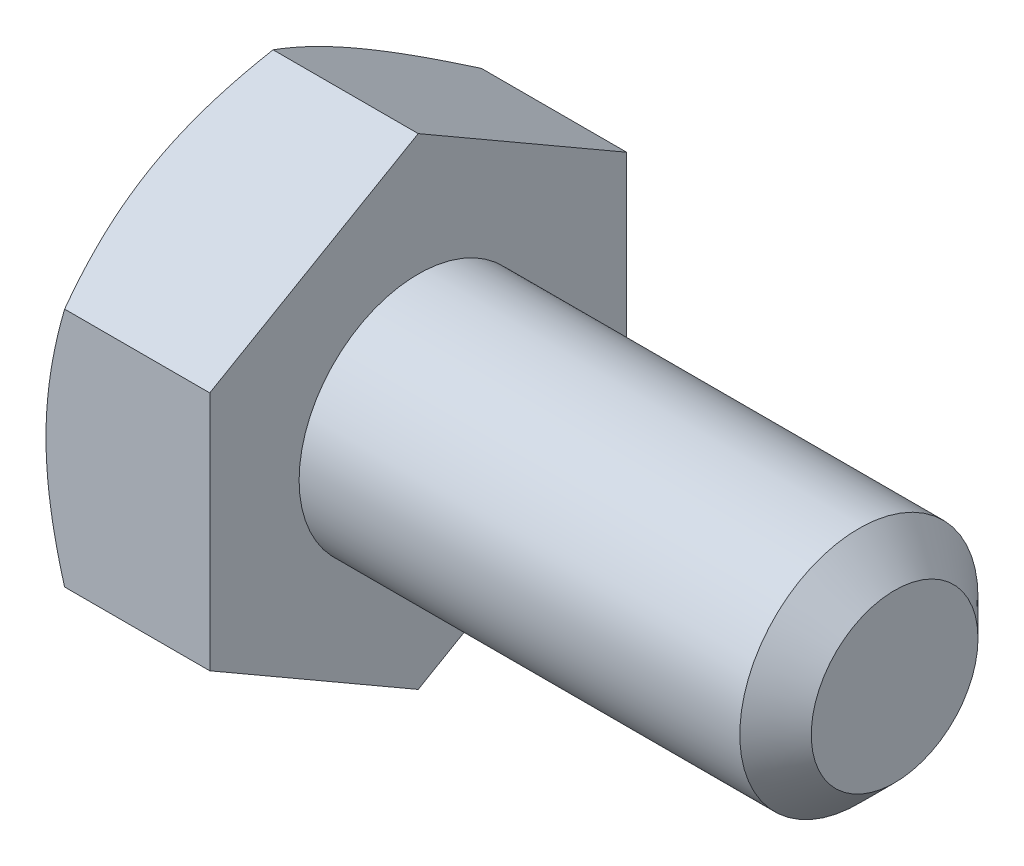
ISO-10303-21;
HEADER;
FILE_DESCRIPTION(('STEP AP214'),'2;1');
FILE_NAME('part.step','',(''),(''),'','','');
FILE_SCHEMA(('AUTOMOTIVE_DESIGN { 1 0 10303 214 1 1 1 1 }'));
ENDSEC;
DATA;
#1=APPLICATION_CONTEXT('core data for automotive mechanical design processes');
#2=APPLICATION_PROTOCOL_DEFINITION('international standard','automotive_design',2000,#1);
#3=PRODUCT_CONTEXT('',#1,'mechanical');
#4=PRODUCT('Part','Part','',(#3));
#5=PRODUCT_RELATED_PRODUCT_CATEGORY('part','',(#4));
#6=PRODUCT_DEFINITION_FORMATION('','',#4);
#7=PRODUCT_DEFINITION_CONTEXT('part definition',#1,'design');
#8=PRODUCT_DEFINITION('design','',#6,#7);
#9=PRODUCT_DEFINITION_SHAPE('','',#8);
#10=(LENGTH_UNIT() NAMED_UNIT(*) SI_UNIT(.MILLI.,.METRE.));
#11=(NAMED_UNIT(*) PLANE_ANGLE_UNIT() SI_UNIT($,.RADIAN.));
#12=(NAMED_UNIT(*) SI_UNIT($,.STERADIAN.) SOLID_ANGLE_UNIT());
#13=UNCERTAINTY_MEASURE_WITH_UNIT(LENGTH_MEASURE(1.E-05),#10,'distance_accuracy_value','');
#14=(GEOMETRIC_REPRESENTATION_CONTEXT(3) GLOBAL_UNCERTAINTY_ASSIGNED_CONTEXT((#13)) GLOBAL_UNIT_ASSIGNED_CONTEXT((#10,
#11,#12)) REPRESENTATION_CONTEXT('',''));
#15=CARTESIAN_POINT('',(0.,0.,0.));
#16=DIRECTION('',(0.,0.,1.));
#17=DIRECTION('',(1.,0.,0.));
#18=AXIS2_PLACEMENT_3D('',#15,#16,#17);
#19=CARTESIAN_POINT('',(-8.5328125,-3.20790243318486,5.55625));
#20=DIRECTION('',(0.,0.,-1.));
#21=DIRECTION('',(0.,1.,0.));
#22=AXIS2_PLACEMENT_3D('',#19,#20,#21);
#23=PLANE('',#22);
#24=CARTESIAN_POINT('',(-5.75937505746155,-8.74399028271724,5.55625));
#25=CARTESIAN_POINT('',(-5.87814764390028,-8.50018624433215,5.55625));
#26=CARTESIAN_POINT('',(-5.99581748774122,-8.25583594838018,5.55625));
#27=CARTESIAN_POINT('',(-6.22833383029307,-7.76575276181024,5.55625));
#28=CARTESIAN_POINT('',(-6.34317990750404,-7.52001967143121,5.55625));
#29=CARTESIAN_POINT('',(-6.56998156509055,-7.02567502758555,5.55625));
#30=CARTESIAN_POINT('',(-6.68191907547585,-6.77705515601887,5.55625));
#31=CARTESIAN_POINT('',(-6.9013791438231,-6.27788161359691,5.55625));
#32=CARTESIAN_POINT('',(-7.00890190233105,-6.02732803119865,5.55625));
#33=CARTESIAN_POINT('',(-7.22190689614603,-5.51539046667092,5.55625));
#34=CARTESIAN_POINT('',(-7.32719770002688,-5.2539264127266,5.55625));
#35=CARTESIAN_POINT('',(-7.53011398514579,-4.72798657849262,5.55625));
#36=CARTESIAN_POINT('',(-7.62773862442336,-4.46351047103703,5.55625));
#37=CARTESIAN_POINT('',(-7.81285321544844,-3.931581690416,5.55625));
#38=CARTESIAN_POINT('',(-7.90036261541582,-3.66413585057299,5.55625));
#39=CARTESIAN_POINT('',(-8.06252244235863,-3.12540698347402,5.55625));
#40=CARTESIAN_POINT('',(-8.13717678606399,-2.85412515234023,5.55625));
#41=CARTESIAN_POINT('',(-8.26973615788486,-2.30908269853906,5.55625));
#42=CARTESIAN_POINT('',(-8.32773466902358,-2.03534517245376,5.55625));
#43=CARTESIAN_POINT('',(-8.42377333221956,-1.48429809984412,5.55625));
#44=CARTESIAN_POINT('',(-8.46181564656405,-1.20698894364918,5.55625));
#45=CARTESIAN_POINT('',(-8.50139280269563,-0.791294728945894,5.55625));
#46=CARTESIAN_POINT('',(-8.511658902021,-0.653708209357041,5.55625));
#47=CARTESIAN_POINT('',(-8.52636218728797,-0.378228688137563,5.55625));
#48=CARTESIAN_POINT('',(-8.53079992639832,-0.240335716836746,5.55625));
#49=CARTESIAN_POINT('',(-8.53373547756868,0.0355251316508515,5.55625));
#50=CARTESIAN_POINT('',(-8.53223277279227,0.173493014310983,5.55625));
#51=CARTESIAN_POINT('',(-8.52332651004236,0.449228447033499,5.55625));
#52=CARTESIAN_POINT('',(-8.51592318141894,0.586996004673771,5.55625));
#53=CARTESIAN_POINT('',(-8.4914869355163,0.914267817860303,5.55625));
#54=CARTESIAN_POINT('',(-8.47186722373091,1.10358331302688,5.55625));
#55=CARTESIAN_POINT('',(-8.42252681193079,1.48088314390515,5.55625));
#56=CARTESIAN_POINT('',(-8.39280484732057,1.66886730995275,5.55625));
#57=CARTESIAN_POINT('',(-8.29005555131187,2.2305609400176,5.55625));
#58=CARTESIAN_POINT('',(-8.20346061251467,2.60182550045217,5.55625));
#59=CARTESIAN_POINT('',(-8.05232610539869,3.15725729103479,5.55625));
#60=CARTESIAN_POINT('',(-7.99765861134242,3.34427702524157,5.55625));
#61=CARTESIAN_POINT('',(-7.88240605233299,3.71650215163137,5.55625));
#62=CARTESIAN_POINT('',(-7.82182094191174,3.90170752986172,5.55625));
#63=CARTESIAN_POINT('',(-7.6957250457604,4.27035971442928,5.55625));
#64=CARTESIAN_POINT('',(-7.63021565507532,4.45380700235122,5.55625));
#65=CARTESIAN_POINT('',(-7.49506591297189,4.81916376783226,5.55625));
#66=CARTESIAN_POINT('',(-7.42542565528425,5.00107328017707,5.55625));
#67=CARTESIAN_POINT('',(-7.23303339482525,5.48965634412821,5.55625));
#68=CARTESIAN_POINT('',(-7.10704727507879,5.79505516029648,5.55625));
#69=CARTESIAN_POINT('',(-6.84769628329585,6.40271511827116,5.55625));
#70=CARTESIAN_POINT('',(-6.71433059931558,6.7049759104509,5.55625));
#71=CARTESIAN_POINT('',(-6.44196311261307,7.30707795631466,5.55625));
#72=CARTESIAN_POINT('',(-6.30295917699313,7.60691824193361,5.55625));
#73=CARTESIAN_POINT('',(-6.02066036323211,8.20455030388993,5.55625));
#74=CARTESIAN_POINT('',(-5.87736565843253,8.50234216238501,5.55625));
#75=CARTESIAN_POINT('',(-5.587187083384,9.09675870347432,5.55625));
#76=CARTESIAN_POINT('',(-5.44029783782258,9.39338075659061,5.55625));
#77=CARTESIAN_POINT('',(-5.14384147507583,9.98528417706331,5.55625));
#78=CARTESIAN_POINT('',(-4.99427433578682,10.2805655333282,5.55625));
#79=CARTESIAN_POINT('',(-4.54243942445416,11.1646418998589,5.55625));
#80=CARTESIAN_POINT('',(-4.23697299944909,11.7518013892495,5.55625));
#81=CARTESIAN_POINT('',(-3.65286795741845,12.8613257589912,5.55625));
#82=CARTESIAN_POINT('',(-3.3747985829024,13.3839917749348,5.55624999999999));
#83=CARTESIAN_POINT('',(-2.8153014266466,14.4275635287064,5.55624999999999));
#84=CARTESIAN_POINT('',(-2.53387343979346,14.9484691565073,5.55624999999999));
#85=CARTESIAN_POINT('',(-1.96947699240156,15.9871873035495,5.55624999999999));
#86=CARTESIAN_POINT('',(-1.68651683374564,16.5050043408021,5.55624999999999));
#87=CARTESIAN_POINT('',(-1.11868986428219,17.5395393833806,5.55624999999999));
#88=CARTESIAN_POINT('',(-0.83382320523055,18.0562574719669,5.55624999999999));
#89=CARTESIAN_POINT('',(-0.548262350510044,18.5725892213169,5.55624999999999));
#90=B_SPLINE_CURVE_WITH_KNOTS('',3,(#24,#25,#26,#27,#28,#29,#30,#31,#32,#33,#34,#35,#36,#37,#38,
#39,#40,#41,#42,#43,#44,#45,#46,#47,#48,#49,#50,#51,#52,#53,#54,#55,#56,#57,#58,#59,#60,#61,#62,
#63,#64,#65,#66,#67,#68,#69,#70,#71,#72,#73,#74,#75,#76,#77,#78,#79,#80,#81,#82,#83,#84,#85,#86,
#87,#88,#89),.UNSPECIFIED.,.F.,.F.,(4,2,2,2,2,2,2,2,2,2,2,2,2,2,2,2,2,2,2,2,2,2,2,2,2,2,2,2,2,2,
2,2,4),(0.,0.81359771644573,1.62731614919359,2.44525275827226,3.26315217028693,4.10866348233596,
4.95426752580812,5.79821771718856,6.64191031370899,7.48077064504382,8.31954006567861,
8.73334238532056,9.14710542821066,9.56090447051725,9.97468742974187,10.545356138106,
11.1160963088497,12.258134229421,12.842619474887,13.4271092116055,14.0114339823823,
14.5957454997084,15.5866951993033,16.5777541467498,17.5691915643883,18.5605889831377,
19.5535724737812,20.5465641644216,22.5321054869691,24.3081902186865,26.0843839782317,
27.8546363211013,29.6247493906644),.UNSPECIFIED.);
#91=CARTESIAN_POINT('',(-8.03654826651819,-3.20790243318486,5.55625));
#92=VERTEX_POINT('',#91);
#93=CARTESIAN_POINT('',(-8.5328125,0.,5.55625));
#94=VERTEX_POINT('',#93);
#95=EDGE_CURVE('E246',#92,#94,#90,.T.);
#96=ORIENTED_EDGE('',*,*,#95,.F.);
#97=DIRECTION('',(1.,0.,0.));
#98=VECTOR('',#97,1.);
#99=CARTESIAN_POINT('',(-8.5328125,-3.20790243318486,5.55625));
#100=LINE('',#99,#98);
#101=CARTESIAN_POINT('',(-4.1671875,-3.20790243318486,5.55625));
#102=VERTEX_POINT('',#101);
#103=EDGE_CURVE('E249',#92,#102,#100,.T.);
#104=ORIENTED_EDGE('',*,*,#103,.T.);
#105=DIRECTION('',(0.,1.,0.));
#106=VECTOR('',#105,1.);
#107=CARTESIAN_POINT('',(-4.1671875,-3.20790243318486,5.55625));
#108=LINE('',#107,#106);
#109=CARTESIAN_POINT('',(-4.1671875,3.20790243318486,5.55625));
#110=VERTEX_POINT('',#109);
#111=EDGE_CURVE('E251',#102,#110,#108,.T.);
#112=ORIENTED_EDGE('',*,*,#111,.T.);
#113=DIRECTION('',(1.,0.,0.));
#114=VECTOR('',#113,1.);
#115=CARTESIAN_POINT('',(-8.5328125,3.20790243318486,5.55625));
#116=LINE('',#115,#114);
#117=CARTESIAN_POINT('',(-8.03654826651819,3.20790243318486,5.55625));
#118=VERTEX_POINT('',#117);
#119=EDGE_CURVE('E219',#118,#110,#116,.T.);
#120=ORIENTED_EDGE('',*,*,#119,.F.);
#121=EDGE_CURVE('E109',#94,#118,#90,.T.);
#122=ORIENTED_EDGE('',*,*,#121,.F.);
#123=EDGE_LOOP('',(#96,#104,#112,#120,#122));
#124=FACE_BOUND('',#123,.T.);
#125=ADVANCED_FACE('F33',(#124),#23,.F.);
#126=CARTESIAN_POINT('',(-8.5328125,3.20790243318486,5.55625));
#127=DIRECTION('',(0.,-0.866025403784439,-0.5));
#128=DIRECTION('',(0.,0.5,-0.866025403784439));
#129=AXIS2_PLACEMENT_3D('',#126,#127,#128);
#130=PLANE('',#129);
#131=CARTESIAN_POINT('',(-8.03648159805178,3.20778696313102,5.55645));
#132=CARTESIAN_POINT('',(-8.07718693962873,3.27830048099899,5.43431700443227));
#133=CARTESIAN_POINT('',(-8.1160449606368,3.34907690760433,5.31172863757365));
#134=CARTESIAN_POINT('',(-8.18955756657542,3.49120454378005,5.06555635055764));
#135=CARTESIAN_POINT('',(-8.22421033819809,3.56255598725623,4.94197202526351));
#136=CARTESIAN_POINT('',(-8.32118061443887,3.7777527611819,4.56924027919934));
#137=CARTESIAN_POINT('',(-8.37633644549796,3.92244755263586,4.3186215488105));
#138=CARTESIAN_POINT('',(-8.44101359515299,4.13898067940739,3.94357517172046));
#139=CARTESIAN_POINT('',(-8.45943832963736,4.21017202280889,3.82026814788997));
#140=CARTESIAN_POINT('',(-8.49033413375964,4.35287639627881,3.57309692257778));
#141=CARTESIAN_POINT('',(-8.50280572943796,4.42438939736052,3.44923277130254));
#142=CARTESIAN_POINT('',(-8.5214774134017,4.56753961185542,3.20128932668298));
#143=CARTESIAN_POINT('',(-8.52768461931661,4.63917659144933,3.07721043832556));
#144=CARTESIAN_POINT('',(-8.53370108258616,4.7825127822332,2.82894487332451));
#145=CARTESIAN_POINT('',(-8.53351053757272,4.85421199143242,2.70475820012895));
#146=CARTESIAN_POINT('',(-8.52419425730709,5.05064720059278,2.36452243746779));
#147=CARTESIAN_POINT('',(-8.50855284031058,5.1753189069971,2.14858470770919));
#148=CARTESIAN_POINT('',(-8.45895259502544,5.42383425573454,1.71814349723526));
#149=CARTESIAN_POINT('',(-8.42497681173333,5.54767702400135,1.50364153044716));
#150=CARTESIAN_POINT('',(-8.34004674995191,5.79669255822861,1.07233397329164));
#151=CARTESIAN_POINT('',(-8.28873261195787,5.92183390122649,0.855582809091895));
#152=CARTESIAN_POINT('',(-8.1722700447076,6.17025031750737,0.425312954659244));
#153=CARTESIAN_POINT('',(-8.10714897412056,6.29352857247572,0.211788753585618));
#154=CARTESIAN_POINT('',(-8.03648159805178,6.41592033642356,-0.000200000000002669));
#155=B_SPLINE_CURVE_WITH_KNOTS('',3,(#131,#132,#133,#134,#135,#136,#137,#138,#139,#140,#141,
#142,#143,#144,#145,#146,#147,#148,#149,#150,#151,#152,#153,#154),.UNSPECIFIED.,.F.,.F.,(4,2,2,
2,2,2,2,2,2,2,2,4),(0.,0.44031690826804,0.880823012040823,1.76366572331169,2.19427472390783,
2.62484566732156,3.05492684132792,3.4849947297767,4.23370964386675,4.98311813377593,
5.74914806559356,6.51367405016873),.UNSPECIFIED.);
#156=CARTESIAN_POINT('',(-8.5328125,4.81185364977729,2.778125));
#157=VERTEX_POINT('',#156);
#158=EDGE_CURVE('E105',#118,#157,#155,.T.);
#159=ORIENTED_EDGE('',*,*,#158,.F.);
#160=ORIENTED_EDGE('',*,*,#119,.T.);
#161=DIRECTION('',(0.,0.5,-0.866025403784439));
#162=VECTOR('',#161,1.);
#163=CARTESIAN_POINT('',(-4.1671875,3.20790243318486,5.55625));
#164=LINE('',#163,#162);
#165=CARTESIAN_POINT('',(-4.1671875,6.41580486636972,0.));
#166=VERTEX_POINT('',#165);
#167=EDGE_CURVE('E269',#110,#166,#164,.T.);
#168=ORIENTED_EDGE('',*,*,#167,.T.);
#169=DIRECTION('',(1.,0.,0.));
#170=VECTOR('',#169,1.);
#171=CARTESIAN_POINT('',(-8.5328125,6.41580486636972,0.));
#172=LINE('',#171,#170);
#173=CARTESIAN_POINT('',(-8.03654826651819,6.41580486636972,0.));
#174=VERTEX_POINT('',#173);
#175=EDGE_CURVE('E128',#174,#166,#172,.T.);
#176=ORIENTED_EDGE('',*,*,#175,.F.);
#177=EDGE_CURVE('E113',#157,#174,#155,.T.);
#178=ORIENTED_EDGE('',*,*,#177,.F.);
#179=EDGE_LOOP('',(#159,#160,#168,#176,#178));
#180=FACE_BOUND('',#179,.T.);
#181=ADVANCED_FACE('F126',(#180),#130,.F.);
#182=CARTESIAN_POINT('',(-8.5328125,6.41580486636972,0.));
#183=DIRECTION('',(0.,-0.866025403784439,0.5));
#184=DIRECTION('',(0.,-0.5,-0.866025403784439));
#185=AXIS2_PLACEMENT_3D('',#182,#183,#184);
#186=PLANE('',#185);
#187=CARTESIAN_POINT('',(-8.03648159805178,6.41592033642356,0.00019999999999752));
#188=CARTESIAN_POINT('',(-8.07718693962873,6.34540681855559,-0.121932995567733));
#189=CARTESIAN_POINT('',(-8.1160449606368,6.27463039195025,-0.244521362426355));
#190=CARTESIAN_POINT('',(-8.18955756657542,6.13250275577454,-0.490693649442359));
#191=CARTESIAN_POINT('',(-8.22421033819808,6.06115131229835,-0.61427797473649));
#192=CARTESIAN_POINT('',(-8.32118061443887,5.84595453837268,-0.987009720800665));
#193=CARTESIAN_POINT('',(-8.37633644549796,5.70125974691872,-1.23762845118951));
#194=CARTESIAN_POINT('',(-8.44101359515299,5.48472662014719,-1.61267482827954));
#195=CARTESIAN_POINT('',(-8.45943832963736,5.41353527674569,-1.73598185211003));
#196=CARTESIAN_POINT('',(-8.49033413375964,5.27083090327577,-1.98315307742222));
#197=CARTESIAN_POINT('',(-8.50280572943796,5.19931790219406,-2.10701722869746));
#198=CARTESIAN_POINT('',(-8.5214774134017,5.05616768769916,-2.35496067331702));
#199=CARTESIAN_POINT('',(-8.52768461931661,4.98453070810525,-2.47903956167444));
#200=CARTESIAN_POINT('',(-8.53370108258616,4.84119451732138,-2.72730512667549));
#201=CARTESIAN_POINT('',(-8.53351053757271,4.76949530812216,-2.85149179987105));
#202=CARTESIAN_POINT('',(-8.52419425730709,4.5730600989618,-3.19172756253221));
#203=CARTESIAN_POINT('',(-8.50855284031058,4.44838839255747,-3.40766529229081));
#204=CARTESIAN_POINT('',(-8.45895259502544,4.19987304382004,-3.83810650276474));
#205=CARTESIAN_POINT('',(-8.42497681173333,4.07603027555323,-4.05260846955284));
#206=CARTESIAN_POINT('',(-8.34004674995191,3.82701474132597,-4.48391602670836));
#207=CARTESIAN_POINT('',(-8.28873261195787,3.70187339832809,-4.7006671909081));
#208=CARTESIAN_POINT('',(-8.1722700447076,3.45345698204722,-5.13093704534075));
#209=CARTESIAN_POINT('',(-8.10714897412056,3.33017872707886,-5.34446124641438));
#210=CARTESIAN_POINT('',(-8.03648159805178,3.20778696313102,-5.55645));
#211=B_SPLINE_CURVE_WITH_KNOTS('',3,(#187,#188,#189,#190,#191,#192,#193,#194,#195,#196,#197,
#198,#199,#200,#201,#202,#203,#204,#205,#206,#207,#208,#209,#210),.UNSPECIFIED.,.F.,.F.,(4,2,2,
2,2,2,2,2,2,2,2,4),(0.,0.440316908268041,0.880823012040823,1.76366572331169,2.19427472390783,
2.62484566732156,3.05492684132792,3.4849947297767,4.23370964386674,4.98311813377593,
5.74914806559356,6.51367405016872),.UNSPECIFIED.);
#212=CARTESIAN_POINT('',(-8.5328125,4.81185364977729,-2.778125));
#213=VERTEX_POINT('',#212);
#214=EDGE_CURVE('E118',#174,#213,#211,.T.);
#215=ORIENTED_EDGE('',*,*,#214,.F.);
#216=ORIENTED_EDGE('',*,*,#175,.T.);
#217=DIRECTION('',(0.,-0.5,-0.866025403784439));
#218=VECTOR('',#217,1.);
#219=CARTESIAN_POINT('',(-4.1671875,6.41580486636972,0.));
#220=LINE('',#219,#218);
#221=CARTESIAN_POINT('',(-4.1671875,3.20790243318486,-5.55625));
#222=VERTEX_POINT('',#221);
#223=EDGE_CURVE('E266',#166,#222,#220,.T.);
#224=ORIENTED_EDGE('',*,*,#223,.T.);
#225=DIRECTION('',(1.,0.,0.));
#226=VECTOR('',#225,1.);
#227=CARTESIAN_POINT('',(-8.5328125,3.20790243318486,-5.55625));
#228=LINE('',#227,#226);
#229=CARTESIAN_POINT('',(-8.03654826651819,3.20790243318486,-5.55625));
#230=VERTEX_POINT('',#229);
#231=EDGE_CURVE('E263',#230,#222,#228,.T.);
#232=ORIENTED_EDGE('',*,*,#231,.F.);
#233=EDGE_CURVE('E129',#213,#230,#211,.T.);
#234=ORIENTED_EDGE('',*,*,#233,.F.);
#235=EDGE_LOOP('',(#215,#216,#224,#232,#234));
#236=FACE_BOUND('',#235,.T.);
#237=ADVANCED_FACE('F183',(#236),#186,.F.);
#238=CARTESIAN_POINT('',(-8.5328125,3.20790243318486,-5.55625));
#239=DIRECTION('',(0.,0.,1.));
#240=DIRECTION('',(0.,-1.,0.));
#241=AXIS2_PLACEMENT_3D('',#238,#239,#240);
#242=PLANE('',#241);
#243=CARTESIAN_POINT('',(-5.75937505984752,-8.74399027782086,-5.55625));
#244=CARTESIAN_POINT('',(-5.87814764618682,-8.50018623960062,-5.55625));
#245=CARTESIAN_POINT('',(-5.99581748992838,-8.25583594381363,-5.55625));
#246=CARTESIAN_POINT('',(-6.22833383228195,-7.76575275757413,-5.55625));
#247=CARTESIAN_POINT('',(-6.34317990939402,-7.52001966736057,-5.55625));
#248=CARTESIAN_POINT('',(-6.56998156678269,-7.02567502384834,-5.55625));
#249=CARTESIAN_POINT('',(-6.68191907706906,-6.77705515244963,-5.55625));
#250=CARTESIAN_POINT('',(-6.90137914522008,-6.27788161036476,-5.55625));
#251=CARTESIAN_POINT('',(-7.00890190363073,-6.02732802813559,-5.55625));
#252=CARTESIAN_POINT('',(-7.22190689724814,-5.51539046395943,-5.55625));
#253=CARTESIAN_POINT('',(-7.32719770102895,-5.25392641019769,-5.55625));
#254=CARTESIAN_POINT('',(-7.53011398595308,-4.72798657633179,-5.55625));
#255=CARTESIAN_POINT('',(-7.62773862513592,-4.4635104690617,-5.55625));
#256=CARTESIAN_POINT('',(-7.81285321598049,-3.93158168881508,-5.55625));
#257=CARTESIAN_POINT('',(-7.90036261586208,-3.66413584916098,-5.55625));
#258=CARTESIAN_POINT('',(-8.06252244264717,-3.12540698244495,-5.55625));
#259=CARTESIAN_POINT('',(-8.13717678628059,-2.8541251515052,-5.55625));
#260=CARTESIAN_POINT('',(-8.26973615795613,-2.30908269819076,-5.55625));
#261=CARTESIAN_POINT('',(-8.32773466902693,-2.03534517239951,-5.55625));
#262=CARTESIAN_POINT('',(-8.42377333213133,-1.4842981003853,-5.55625));
#263=CARTESIAN_POINT('',(-8.46181564645213,-1.20698894449172,-5.55625));
#264=CARTESIAN_POINT('',(-8.50139280258827,-0.791294730238444,-5.55625));
#265=CARTESIAN_POINT('',(-8.51165890192166,-0.653708210797409,-5.55625));
#266=CARTESIAN_POINT('',(-8.52636218721775,-0.378228689873304,-5.55625));
#267=CARTESIAN_POINT('',(-8.5307999263492,-0.24033571872004,-5.55625));
#268=CARTESIAN_POINT('',(-8.53373547757459,0.0355251294734932,-5.55625));
#269=CARTESIAN_POINT('',(-8.53223277283213,0.173493011987113,-5.55625));
#270=CARTESIAN_POINT('',(-8.52332651016204,0.449228444418533,-5.55625));
#271=CARTESIAN_POINT('',(-8.5159231815845,0.586996001914218,-5.55625));
#272=CARTESIAN_POINT('',(-8.49148693579466,0.914267814878999,-5.55625));
#273=CARTESIAN_POINT('',(-8.47186722407407,1.10358330996903,-5.55625));
#274=CARTESIAN_POINT('',(-8.42252681240702,1.48088314069774,-5.55625));
#275=CARTESIAN_POINT('',(-8.39280484786505,1.66886730667231,-5.55625));
#276=CARTESIAN_POINT('',(-8.29005555206251,2.23056093652212,-5.55625));
#277=CARTESIAN_POINT('',(-8.20346061340452,2.60182549681905,-5.55625));
#278=CARTESIAN_POINT('',(-8.05232610649388,3.15725728719582,-5.55625));
#279=CARTESIAN_POINT('',(-7.99765861250653,3.34427702133249,-5.55625));
#280=CARTESIAN_POINT('',(-7.88240605363278,3.71650214758286,-5.55625));
#281=CARTESIAN_POINT('',(-7.8218209432783,3.9017075257439,-5.55625));
#282=CARTESIAN_POINT('',(-7.69572504725805,4.27035971017337,-5.55625));
#283=CARTESIAN_POINT('',(-7.6302156566373,4.45380699802653,-5.55625));
#284=CARTESIAN_POINT('',(-7.49506591466025,4.81916376337001,-5.55625));
#285=CARTESIAN_POINT('',(-7.42542565703466,5.00107327564603,-5.55625));
#286=CARTESIAN_POINT('',(-7.23303339668232,5.48965633955828,-5.55625));
#287=CARTESIAN_POINT('',(-7.10704727697377,5.79505515575441,-5.55625));
#288=CARTESIAN_POINT('',(-6.84769628525567,6.4027151137812,-5.55625));
#289=CARTESIAN_POINT('',(-6.71433060130234,6.7049759059852,-5.55625));
#290=CARTESIAN_POINT('',(-6.44196311464574,7.3070779518949,-5.55625));
#291=CARTESIAN_POINT('',(-6.30295917904476,7.60691823753553,-5.55625));
#292=CARTESIAN_POINT('',(-6.02066036531605,8.20455029953286,-5.55625));
#293=CARTESIAN_POINT('',(-5.87736566052982,8.50234215804726,-5.55625));
#294=CARTESIAN_POINT('',(-5.5871870855033,9.09675869917466,-5.55625));
#295=CARTESIAN_POINT('',(-5.44029783995052,9.3933807523097,-5.55625));
#296=CARTESIAN_POINT('',(-5.14384147721795,9.98528417281851,-5.55625));
#297=CARTESIAN_POINT('',(-4.99427433793449,10.2805655291007,-5.55625));
#298=CARTESIAN_POINT('',(-4.54243942661521,11.1646418956815,-5.55625));
#299=CARTESIAN_POINT('',(-4.23697300161453,11.7518013851031,-5.55625));
#300=CARTESIAN_POINT('',(-3.65286795960051,12.8613257548756,-5.55625));
#301=CARTESIAN_POINT('',(-3.37479858509745,13.3839917708193,-5.55625));
#302=CARTESIAN_POINT('',(-2.81530142886497,14.42756352459,-5.55625));
#303=CARTESIAN_POINT('',(-2.53387344202215,14.9484691523898,-5.55625));
#304=CARTESIAN_POINT('',(-1.96947699465148,15.9871872994245,-5.55625));
#305=CARTESIAN_POINT('',(-1.68651683600648,16.5050043366708,-5.55625));
#306=CARTESIAN_POINT('',(-1.11868986656369,17.5395393792358,-5.55625));
#307=CARTESIAN_POINT('',(-0.83382320752179,18.056257467815,-5.55625));
#308=CARTESIAN_POINT('',(-0.548262352810627,18.5725892171576,-5.55625));
#309=B_SPLINE_CURVE_WITH_KNOTS('',3,(#243,#244,#245,#246,#247,#248,#249,#250,#251,#252,#253,
#254,#255,#256,#257,#258,#259,#260,#261,#262,#263,#264,#265,#266,#267,#268,#269,#270,#271,#272,
#273,#274,#275,#276,#277,#278,#279,#280,#281,#282,#283,#284,#285,#286,#287,#288,#289,#290,#291,
#292,#293,#294,#295,#296,#297,#298,#299,#300,#301,#302,#303,#304,#305,#306,#307,#308),
.UNSPECIFIED.,.F.,.F.,(4,2,2,2,2,2,2,2,2,2,2,2,2,2,2,2,2,2,2,2,2,2,2,2,2,2,2,2,2,2,2,2,4),(0.,
0.813597715870463,1.62731614804298,2.44525275654031,3.26315216797368,4.10866347940256,
4.95426752225438,5.79821771301646,6.64191030891903,7.48077063935046,8.31954005908318,
8.73334237828505,9.1471054207352,9.56090446260156,9.97468742138602,10.5453561295019,
11.1160962999972,12.2581342200709,12.8426194652768,13.4271092017353,14.0114339722529,
14.5957454893196,15.5866951889479,16.5777541364282,17.5691915541016,18.560588972886,
19.5535724635683,20.5465641542476,22.5321054768716,24.308190208571,26.0843839680985,
27.8546363109357,29.624749380466),.UNSPECIFIED.);
#310=CARTESIAN_POINT('',(-8.5328125,0.,-5.55625));
#311=VERTEX_POINT('',#310);
#312=EDGE_CURVE('E177',#230,#311,#309,.F.);
#313=ORIENTED_EDGE('',*,*,#312,.F.);
#314=ORIENTED_EDGE('',*,*,#231,.T.);
#315=DIRECTION('',(0.,-1.,0.));
#316=VECTOR('',#315,1.);
#317=CARTESIAN_POINT('',(-4.1671875,3.20790243318486,-5.55625));
#318=LINE('',#317,#316);
#319=CARTESIAN_POINT('',(-4.1671875,-3.20790243318486,-5.55625));
#320=VERTEX_POINT('',#319);
#321=EDGE_CURVE('E273',#222,#320,#318,.T.);
#322=ORIENTED_EDGE('',*,*,#321,.T.);
#323=DIRECTION('',(1.,0.,0.));
#324=VECTOR('',#323,1.);
#325=CARTESIAN_POINT('',(-8.5328125,-3.20790243318486,-5.55625));
#326=LINE('',#325,#324);
#327=CARTESIAN_POINT('',(-8.03654826651819,-3.20790243318486,-5.55625));
#328=VERTEX_POINT('',#327);
#329=EDGE_CURVE('E234',#328,#320,#326,.T.);
#330=ORIENTED_EDGE('',*,*,#329,.F.);
#331=EDGE_CURVE('E172',#311,#328,#309,.F.);
#332=ORIENTED_EDGE('',*,*,#331,.F.);
#333=EDGE_LOOP('',(#313,#314,#322,#330,#332));
#334=FACE_BOUND('',#333,.T.);
#335=ADVANCED_FACE('F179',(#334),#242,.F.);
#336=CARTESIAN_POINT('',(-8.5328125,-3.20790243318486,-5.55625));
#337=DIRECTION('',(0.,0.866025403784439,0.5));
#338=DIRECTION('',(0.,-0.5,0.866025403784439));
#339=AXIS2_PLACEMENT_3D('',#336,#337,#338);
#340=PLANE('',#339);
#341=CARTESIAN_POINT('',(-8.03648159805178,-3.20778696313102,-5.55645));
#342=CARTESIAN_POINT('',(-8.07718693962873,-3.27830048099899,-5.43431700443227));
#343=CARTESIAN_POINT('',(-8.1160449606368,-3.34907690760433,-5.31172863757365));
#344=CARTESIAN_POINT('',(-8.18955756657542,-3.49120454378004,-5.06555635055764));
#345=CARTESIAN_POINT('',(-8.22421033819809,-3.56255598725623,-4.94197202526351));
#346=CARTESIAN_POINT('',(-8.32118061443887,-3.7777527611819,-4.56924027919934));
#347=CARTESIAN_POINT('',(-8.37633644549796,-3.92244755263586,-4.3186215488105));
#348=CARTESIAN_POINT('',(-8.44101359515299,-4.13898067940739,-3.94357517172046));
#349=CARTESIAN_POINT('',(-8.45943832963736,-4.21017202280889,-3.82026814788998));
#350=CARTESIAN_POINT('',(-8.49033413375964,-4.35287639627881,-3.57309692257778));
#351=CARTESIAN_POINT('',(-8.50280572943796,-4.42438939736052,-3.44923277130254));
#352=CARTESIAN_POINT('',(-8.5214774134017,-4.56753961185542,-3.20128932668298));
#353=CARTESIAN_POINT('',(-8.52768461931661,-4.63917659144933,-3.07721043832556));
#354=CARTESIAN_POINT('',(-8.53370108258616,-4.7825127822332,-2.82894487332451));
#355=CARTESIAN_POINT('',(-8.53351053757272,-4.85421199143242,-2.70475820012895));
#356=CARTESIAN_POINT('',(-8.52419425730709,-5.05064720059278,-2.36452243746779));
#357=CARTESIAN_POINT('',(-8.50855284031058,-5.1753189069971,-2.14858470770919));
#358=CARTESIAN_POINT('',(-8.45895259502544,-5.42383425573454,-1.71814349723526));
#359=CARTESIAN_POINT('',(-8.42497681173333,-5.54767702400135,-1.50364153044716));
#360=CARTESIAN_POINT('',(-8.34004674995191,-5.79669255822861,-1.07233397329164));
#361=CARTESIAN_POINT('',(-8.28873261195787,-5.92183390122649,-0.855582809091898));
#362=CARTESIAN_POINT('',(-8.1722700447076,-6.17025031750737,-0.425312954659247));
#363=CARTESIAN_POINT('',(-8.10714897412056,-6.29352857247572,-0.211788753585621));
#364=CARTESIAN_POINT('',(-8.03648159805178,-6.41592033642355,0.000199999999999532));
#365=B_SPLINE_CURVE_WITH_KNOTS('',3,(#341,#342,#343,#344,#345,#346,#347,#348,#349,#350,#351,
#352,#353,#354,#355,#356,#357,#358,#359,#360,#361,#362,#363,#364),.UNSPECIFIED.,.F.,.F.,(4,2,2,
2,2,2,2,2,2,2,2,4),(0.,0.440316908268042,0.880823012040824,1.76366572331169,2.19427472390783,
2.62484566732156,3.05492684132792,3.4849947297767,4.23370964386675,4.98311813377593,
5.74914806559356,6.51367405016872),.UNSPECIFIED.);
#366=CARTESIAN_POINT('',(-8.5328125,-4.81185364977729,-2.778125));
#367=VERTEX_POINT('',#366);
#368=EDGE_CURVE('E178',#328,#367,#365,.T.);
#369=ORIENTED_EDGE('',*,*,#368,.F.);
#370=ORIENTED_EDGE('',*,*,#329,.T.);
#371=DIRECTION('',(0.,-0.5,0.866025403784439));
#372=VECTOR('',#371,1.);
#373=CARTESIAN_POINT('',(-4.1671875,-3.20790243318486,-5.55625));
#374=LINE('',#373,#372);
#375=CARTESIAN_POINT('',(-4.1671875,-6.41580486636972,0.));
#376=VERTEX_POINT('',#375);
#377=EDGE_CURVE('E258',#320,#376,#374,.T.);
#378=ORIENTED_EDGE('',*,*,#377,.T.);
#379=DIRECTION('',(1.,0.,0.));
#380=VECTOR('',#379,1.);
#381=CARTESIAN_POINT('',(-8.5328125,-6.41580486636972,0.));
#382=LINE('',#381,#380);
#383=CARTESIAN_POINT('',(-8.03654826651819,-6.41580486636972,0.));
#384=VERTEX_POINT('',#383);
#385=EDGE_CURVE('E255',#384,#376,#382,.T.);
#386=ORIENTED_EDGE('',*,*,#385,.F.);
#387=EDGE_CURVE('E167',#367,#384,#365,.T.);
#388=ORIENTED_EDGE('',*,*,#387,.F.);
#389=EDGE_LOOP('',(#369,#370,#378,#386,#388));
#390=FACE_BOUND('',#389,.T.);
#391=ADVANCED_FACE('F182',(#390),#340,.F.);
#392=CARTESIAN_POINT('',(-8.5328125,-6.41580486636972,0.));
#393=DIRECTION('',(0.,0.866025403784439,-0.5));
#394=DIRECTION('',(0.,0.5,0.866025403784439));
#395=AXIS2_PLACEMENT_3D('',#392,#393,#394);
#396=PLANE('',#395);
#397=CARTESIAN_POINT('',(-8.03648159805178,-6.41592033642356,-0.000200000000000943));
#398=CARTESIAN_POINT('',(-8.07718693962873,-6.34540681855559,0.12193299556773));
#399=CARTESIAN_POINT('',(-8.1160449606368,-6.27463039195025,0.244521362426352));
#400=CARTESIAN_POINT('',(-8.18955756657542,-6.13250275577453,0.490693649442355));
#401=CARTESIAN_POINT('',(-8.22421033819809,-6.06115131229835,0.614277974736486));
#402=CARTESIAN_POINT('',(-8.32118061443887,-5.84595453837268,0.98700972080066));
#403=CARTESIAN_POINT('',(-8.37633644549796,-5.70125974691872,1.2376284511895));
#404=CARTESIAN_POINT('',(-8.44101359515299,-5.48472662014719,1.61267482827954));
#405=CARTESIAN_POINT('',(-8.45943832963736,-5.41353527674569,1.73598185211002));
#406=CARTESIAN_POINT('',(-8.49033413375964,-5.27083090327577,1.98315307742221));
#407=CARTESIAN_POINT('',(-8.50280572943796,-5.19931790219406,2.10701722869746));
#408=CARTESIAN_POINT('',(-8.5214774134017,-5.05616768769916,2.35496067331701));
#409=CARTESIAN_POINT('',(-8.52768461931661,-4.98453070810525,2.47903956167444));
#410=CARTESIAN_POINT('',(-8.53370108258616,-4.84119451732138,2.72730512667549));
#411=CARTESIAN_POINT('',(-8.53351053757272,-4.76949530812216,2.85149179987105));
#412=CARTESIAN_POINT('',(-8.52419425730709,-4.5730600989618,3.19172756253221));
#413=CARTESIAN_POINT('',(-8.50855284031058,-4.44838839255747,3.40766529229081));
#414=CARTESIAN_POINT('',(-8.45895259502544,-4.19987304382004,3.83810650276474));
#415=CARTESIAN_POINT('',(-8.42497681173333,-4.07603027555323,4.05260846955284));
#416=CARTESIAN_POINT('',(-8.34004674995191,-3.82701474132597,4.48391602670836));
#417=CARTESIAN_POINT('',(-8.28873261195787,-3.70187339832808,4.7006671909081));
#418=CARTESIAN_POINT('',(-8.1722700447076,-3.45345698204721,5.13093704534075));
#419=CARTESIAN_POINT('',(-8.10714897412056,-3.33017872707885,5.34446124641438));
#420=CARTESIAN_POINT('',(-8.03648159805178,-3.20778696313102,5.55645));
#421=B_SPLINE_CURVE_WITH_KNOTS('',3,(#397,#398,#399,#400,#401,#402,#403,#404,#405,#406,#407,
#408,#409,#410,#411,#412,#413,#414,#415,#416,#417,#418,#419,#420),.UNSPECIFIED.,.F.,.F.,(4,2,2,
2,2,2,2,2,2,2,2,4),(0.,0.440316908268041,0.880823012040822,1.76366572331169,2.19427472390783,
2.62484566732156,3.05492684132792,3.48499472977669,4.23370964386675,4.98311813377593,
5.74914806559356,6.51367405016873),.UNSPECIFIED.);
#422=CARTESIAN_POINT('',(-8.5328125,-4.81185364977729,2.778125));
#423=VERTEX_POINT('',#422);
#424=EDGE_CURVE('E241',#384,#423,#421,.T.);
#425=ORIENTED_EDGE('',*,*,#424,.F.);
#426=ORIENTED_EDGE('',*,*,#385,.T.);
#427=DIRECTION('',(0.,0.5,0.866025403784439));
#428=VECTOR('',#427,1.);
#429=CARTESIAN_POINT('',(-4.1671875,-6.41580486636972,0.));
#430=LINE('',#429,#428);
#431=EDGE_CURVE('E253',#376,#102,#430,.T.);
#432=ORIENTED_EDGE('',*,*,#431,.T.);
#433=ORIENTED_EDGE('',*,*,#103,.F.);
#434=EDGE_CURVE('E123',#423,#92,#421,.T.);
#435=ORIENTED_EDGE('',*,*,#434,.F.);
#436=EDGE_LOOP('',(#425,#426,#432,#433,#435));
#437=FACE_BOUND('',#436,.T.);
#438=ADVANCED_FACE('F204',(#437),#396,.F.);
#439=CARTESIAN_POINT('',(-4.1671875,0.,0.));
#440=DIRECTION('',(1.,0.,0.));
#441=DIRECTION('',(0.,0.,-1.));
#442=AXIS2_PLACEMENT_3D('',#439,#440,#441);
#443=CYLINDRICAL_SURFACE('',#442,3.175);
#444=CARTESIAN_POINT('',(7.5803125,0.,0.));
#445=DIRECTION('',(1.,0.,0.));
#446=DIRECTION('',(0.,0.,-1.));
#447=AXIS2_PLACEMENT_3D('',#444,#445,#446);
#448=CIRCLE('',#447,3.175);
#449=CARTESIAN_POINT('',(7.5803125,0.,-3.175));
#450=VERTEX_POINT('',#449);
#451=EDGE_CURVE('E213',#450,#450,#448,.F.);
#452=ORIENTED_EDGE('',*,*,#451,.T.);
#453=EDGE_LOOP('',(#452));
#454=FACE_BOUND('',#453,.T.);
#455=CARTESIAN_POINT('',(-4.1671875,0.,0.));
#456=DIRECTION('',(-1.,0.,0.));
#457=DIRECTION('',(0.,0.,1.));
#458=AXIS2_PLACEMENT_3D('',#455,#456,#457);
#459=CIRCLE('',#458,3.175);
#460=CARTESIAN_POINT('',(-4.1671875,0.,3.175));
#461=VERTEX_POINT('',#460);
#462=EDGE_CURVE('E216',#461,#461,#459,.F.);
#463=ORIENTED_EDGE('',*,*,#462,.T.);
#464=EDGE_LOOP('',(#463));
#465=FACE_BOUND('',#464,.T.);
#466=ADVANCED_FACE('F201',(#454,#465),#443,.T.);
#467=CARTESIAN_POINT('',(8.5328125,0.,0.));
#468=DIRECTION('',(1.,0.,0.));
#469=DIRECTION('',(0.,0.,-1.));
#470=AXIS2_PLACEMENT_3D('',#467,#468,#469);
#471=PLANE('',#470);
#472=CARTESIAN_POINT('',(8.5328125,0.,0.));
#473=DIRECTION('',(1.,0.,0.));
#474=DIRECTION('',(0.,0.,-1.));
#475=AXIS2_PLACEMENT_3D('',#472,#473,#474);
#476=CIRCLE('',#475,2.2225);
#477=CARTESIAN_POINT('',(8.5328125,0.,-2.2225));
#478=VERTEX_POINT('',#477);
#479=EDGE_CURVE('E218',#478,#478,#476,.T.);
#480=ORIENTED_EDGE('',*,*,#479,.T.);
#481=EDGE_LOOP('',(#480));
#482=FACE_BOUND('',#481,.T.);
#483=ADVANCED_FACE('F199',(#482),#471,.T.);
#484=CARTESIAN_POINT('',(8.5328125,0.,0.));
#485=DIRECTION('',(-1.,0.,0.));
#486=DIRECTION('',(0.,0.,1.));
#487=AXIS2_PLACEMENT_3D('',#484,#485,#486);
#488=CONICAL_SURFACE('',#487,2.2225,0.785398163397446);
#489=ORIENTED_EDGE('',*,*,#451,.F.);
#490=EDGE_LOOP('',(#489));
#491=FACE_BOUND('',#490,.T.);
#492=ORIENTED_EDGE('',*,*,#479,.F.);
#493=EDGE_LOOP('',(#492));
#494=FACE_BOUND('',#493,.T.);
#495=ADVANCED_FACE('F35',(#491,#494),#488,.T.);
#496=CARTESIAN_POINT('',(-4.1671875,3.20790243318486,5.55625));
#497=DIRECTION('',(-1.,0.,0.));
#498=DIRECTION('',(0.,0.,1.));
#499=AXIS2_PLACEMENT_3D('',#496,#497,#498);
#500=PLANE('',#499);
#501=ORIENTED_EDGE('',*,*,#462,.F.);
#502=EDGE_LOOP('',(#501));
#503=FACE_BOUND('',#502,.T.);
#504=ORIENTED_EDGE('',*,*,#111,.F.);
#505=ORIENTED_EDGE('',*,*,#431,.F.);
#506=ORIENTED_EDGE('',*,*,#377,.F.);
#507=ORIENTED_EDGE('',*,*,#321,.F.);
#508=ORIENTED_EDGE('',*,*,#223,.F.);
#509=ORIENTED_EDGE('',*,*,#167,.F.);
#510=EDGE_LOOP('',(#504,#505,#506,#507,#508,#509));
#511=FACE_BOUND('',#510,.T.);
#512=ADVANCED_FACE('F153',(#503,#511),#500,.F.);
#513=CARTESIAN_POINT('',(-8.5328125,0.,0.));
#514=DIRECTION('',(1.,0.,0.));
#515=DIRECTION('',(0.,0.,1.));
#516=AXIS2_PLACEMENT_3D('',#513,#514,#515);
#517=CONICAL_SURFACE('',#516,5.55625,1.0471975511966);
#518=ORIENTED_EDGE('',*,*,#95,.T.);
#519=CARTESIAN_POINT('',(-8.5328125,0.,0.));
#520=DIRECTION('',(-1.,0.,0.));
#521=DIRECTION('',(0.,0.,1.));
#522=AXIS2_PLACEMENT_3D('',#519,#520,#521);
#523=CIRCLE('',#522,5.55625);
#524=EDGE_CURVE('E37',#423,#94,#523,.T.);
#525=ORIENTED_EDGE('',*,*,#524,.F.);
#526=ORIENTED_EDGE('',*,*,#434,.T.);
#527=EDGE_LOOP('',(#518,#525,#526));
#528=FACE_BOUND('',#527,.T.);
#529=ADVANCED_FACE('F148',(#528),#517,.T.);
#530=ORIENTED_EDGE('',*,*,#387,.T.);
#531=ORIENTED_EDGE('',*,*,#424,.T.);
#532=EDGE_CURVE('E57',#367,#423,#523,.T.);
#533=ORIENTED_EDGE('',*,*,#532,.F.);
#534=EDGE_LOOP('',(#530,#531,#533));
#535=FACE_BOUND('',#534,.T.);
#536=ADVANCED_FACE('F152',(#535),#517,.T.);
#537=ORIENTED_EDGE('',*,*,#331,.T.);
#538=ORIENTED_EDGE('',*,*,#368,.T.);
#539=EDGE_CURVE('E225',#311,#367,#523,.T.);
#540=ORIENTED_EDGE('',*,*,#539,.F.);
#541=EDGE_LOOP('',(#537,#538,#540));
#542=FACE_BOUND('',#541,.T.);
#543=ADVANCED_FACE('F237',(#542),#517,.T.);
#544=ORIENTED_EDGE('',*,*,#233,.T.);
#545=ORIENTED_EDGE('',*,*,#312,.T.);
#546=EDGE_CURVE('E42',#213,#311,#523,.T.);
#547=ORIENTED_EDGE('',*,*,#546,.F.);
#548=EDGE_LOOP('',(#544,#545,#547));
#549=FACE_BOUND('',#548,.T.);
#550=ADVANCED_FACE('F276',(#549),#517,.T.);
#551=ORIENTED_EDGE('',*,*,#177,.T.);
#552=ORIENTED_EDGE('',*,*,#214,.T.);
#553=EDGE_CURVE('E12',#157,#213,#523,.T.);
#554=ORIENTED_EDGE('',*,*,#553,.F.);
#555=EDGE_LOOP('',(#551,#552,#554));
#556=FACE_BOUND('',#555,.T.);
#557=ADVANCED_FACE('F116',(#556),#517,.T.);
#558=ORIENTED_EDGE('',*,*,#121,.T.);
#559=ORIENTED_EDGE('',*,*,#158,.T.);
#560=CARTESIAN_POINT('',(-8.5328125,0.,0.));
#561=DIRECTION('',(-1.,0.,0.));
#562=DIRECTION('',(0.,0.,1.));
#563=AXIS2_PLACEMENT_3D('',#560,#561,#562);
#564=CIRCLE('',#563,5.55625);
#565=EDGE_CURVE('E49',#94,#157,#564,.T.);
#566=ORIENTED_EDGE('',*,*,#565,.F.);
#567=EDGE_LOOP('',(#558,#559,#566));
#568=FACE_BOUND('',#567,.T.);
#569=ADVANCED_FACE('F107',(#568),#517,.T.);
#570=CARTESIAN_POINT('',(-8.5328125,3.20790243318486,5.55625));
#571=DIRECTION('',(-1.,0.,0.));
#572=DIRECTION('',(0.,0.,1.));
#573=AXIS2_PLACEMENT_3D('',#570,#571,#572);
#574=PLANE('',#573);
#575=ORIENTED_EDGE('',*,*,#524,.T.);
#576=ORIENTED_EDGE('',*,*,#565,.T.);
#577=ORIENTED_EDGE('',*,*,#553,.T.);
#578=ORIENTED_EDGE('',*,*,#546,.T.);
#579=ORIENTED_EDGE('',*,*,#539,.T.);
#580=ORIENTED_EDGE('',*,*,#532,.T.);
#581=EDGE_LOOP('',(#575,#576,#577,#578,#579,#580));
#582=FACE_BOUND('',#581,.T.);
#583=ADVANCED_FACE('F122',(#582),#574,.T.);
#584=CLOSED_SHELL('',(#125,#181,#237,#335,#391,#438,#466,#483,#495,#512,#529,#536,#543,#550,
#557,#569,#583));
#585=MANIFOLD_SOLID_BREP('B2',#584);
#586=ADVANCED_BREP_SHAPE_REPRESENTATION('',(#18,#585),#14);
#587=SHAPE_DEFINITION_REPRESENTATION(#9,#586);
ENDSEC;
END-ISO-10303-21;
